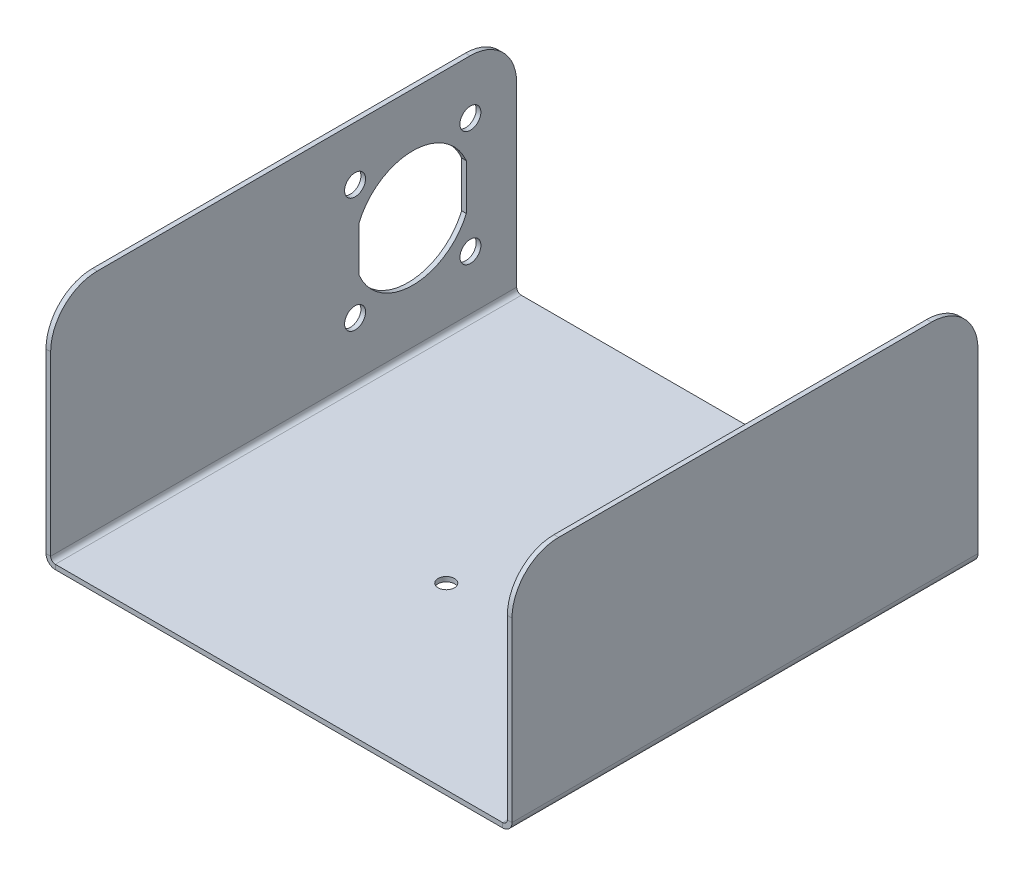
ISO-10303-21;
HEADER;
FILE_DESCRIPTION(('STEP AP214'),'2;1');
FILE_NAME('part.step','',(''),(''),'','','');
FILE_SCHEMA(('AUTOMOTIVE_DESIGN { 1 0 10303 214 1 1 1 1 }'));
ENDSEC;
DATA;
#1=APPLICATION_CONTEXT('core data for automotive mechanical design processes');
#2=APPLICATION_PROTOCOL_DEFINITION('international standard','automotive_design',2000,#1);
#3=PRODUCT_CONTEXT('',#1,'mechanical');
#4=PRODUCT('Part','Part','',(#3));
#5=PRODUCT_RELATED_PRODUCT_CATEGORY('part','',(#4));
#6=PRODUCT_DEFINITION_FORMATION('','',#4);
#7=PRODUCT_DEFINITION_CONTEXT('part definition',#1,'design');
#8=PRODUCT_DEFINITION('design','',#6,#7);
#9=PRODUCT_DEFINITION_SHAPE('','',#8);
#10=(LENGTH_UNIT() NAMED_UNIT(*) SI_UNIT(.MILLI.,.METRE.));
#11=(NAMED_UNIT(*) PLANE_ANGLE_UNIT() SI_UNIT($,.RADIAN.));
#12=(NAMED_UNIT(*) SI_UNIT($,.STERADIAN.) SOLID_ANGLE_UNIT());
#13=UNCERTAINTY_MEASURE_WITH_UNIT(LENGTH_MEASURE(1.E-05),#10,'distance_accuracy_value','');
#14=(GEOMETRIC_REPRESENTATION_CONTEXT(3) GLOBAL_UNCERTAINTY_ASSIGNED_CONTEXT((#13)) GLOBAL_UNIT_ASSIGNED_CONTEXT((#10,
#11,#12)) REPRESENTATION_CONTEXT('',''));
#15=CARTESIAN_POINT('',(0.,0.,0.));
#16=DIRECTION('',(0.,0.,1.));
#17=DIRECTION('',(1.,0.,0.));
#18=AXIS2_PLACEMENT_3D('',#15,#16,#17);
#19=CARTESIAN_POINT('',(0.,-1.,0.));
#20=DIRECTION('',(0.,-1.,0.));
#21=DIRECTION('',(0.,0.,-1.));
#22=AXIS2_PLACEMENT_3D('',#19,#20,#21);
#23=PLANE('',#22);
#24=CARTESIAN_POINT('',(60.,-1.,-60.2));
#25=DIRECTION('',(0.,-1.,0.));
#26=DIRECTION('',(0.,0.,-1.));
#27=AXIS2_PLACEMENT_3D('',#24,#25,#26);
#28=CIRCLE('',#27,1.75);
#29=CARTESIAN_POINT('',(60.,-1.,-61.95));
#30=VERTEX_POINT('',#29);
#31=EDGE_CURVE('E821',#30,#30,#28,.T.);
#32=ORIENTED_EDGE('',*,*,#31,.F.);
#33=EDGE_LOOP('',(#32));
#34=FACE_BOUND('',#33,.T.);
#35=CARTESIAN_POINT('',(72.5573683548742,-1.,-38.4499999999999));
#36=DIRECTION('',(0.,-1.,0.));
#37=DIRECTION('',(0.,0.,-1.));
#38=AXIS2_PLACEMENT_3D('',#35,#36,#37);
#39=CIRCLE('',#38,1.75);
#40=CARTESIAN_POINT('',(72.5573683548742,-1.,-40.1999999999999));
#41=VERTEX_POINT('',#40);
#42=EDGE_CURVE('E816',#41,#41,#39,.T.);
#43=ORIENTED_EDGE('',*,*,#42,.F.);
#44=EDGE_LOOP('',(#43));
#45=FACE_BOUND('',#44,.T.);
#46=CARTESIAN_POINT('',(47.4426316451255,-1.,-38.4500000000001));
#47=DIRECTION('',(0.,-1.,0.));
#48=DIRECTION('',(0.,0.,-1.));
#49=AXIS2_PLACEMENT_3D('',#46,#47,#48);
#50=CIRCLE('',#49,1.75);
#51=CARTESIAN_POINT('',(47.4426316451255,-1.,-40.2000000000001));
#52=VERTEX_POINT('',#51);
#53=EDGE_CURVE('E809',#52,#52,#50,.T.);
#54=ORIENTED_EDGE('',*,*,#53,.F.);
#55=EDGE_LOOP('',(#54));
#56=FACE_BOUND('',#55,.T.);
#57=CARTESIAN_POINT('',(59.9999999999999,-1.,-45.7));
#58=DIRECTION('',(0.,-1.,0.));
#59=DIRECTION('',(0.,0.,-1.));
#60=AXIS2_PLACEMENT_3D('',#57,#58,#59);
#61=CIRCLE('',#60,3.24999999999999);
#62=CARTESIAN_POINT('',(59.9999999999999,-1.,-48.95));
#63=VERTEX_POINT('',#62);
#64=EDGE_CURVE('E254',#63,#63,#61,.T.);
#65=ORIENTED_EDGE('',*,*,#64,.F.);
#66=EDGE_LOOP('',(#65));
#67=FACE_BOUND('',#66,.T.);
#68=DIRECTION('',(1.,0.,0.));
#69=VECTOR('',#68,1.);
#70=CARTESIAN_POINT('',(0.,-1.,0.));
#71=LINE('',#70,#69);
#72=CARTESIAN_POINT('',(2.00000000000001,-1.00000000000001,0.));
#73=VERTEX_POINT('',#72);
#74=CARTESIAN_POINT('',(97.9999999999999,-1.,0.));
#75=VERTEX_POINT('',#74);
#76=EDGE_CURVE('E467',#73,#75,#71,.T.);
#77=ORIENTED_EDGE('',*,*,#76,.F.);
#78=DIRECTION('',(0.,0.,1.));
#79=VECTOR('',#78,1.);
#80=CARTESIAN_POINT('',(2.00000000000001,-1.00000000000001,0.));
#81=LINE('',#80,#79);
#82=CARTESIAN_POINT('',(2.,-1.,-100.));
#83=VERTEX_POINT('',#82);
#84=EDGE_CURVE('E393',#73,#83,#81,.F.);
#85=ORIENTED_EDGE('',*,*,#84,.T.);
#86=DIRECTION('',(-1.,0.,0.));
#87=VECTOR('',#86,1.);
#88=CARTESIAN_POINT('',(0.,-1.,-100.));
#89=LINE('',#88,#87);
#90=CARTESIAN_POINT('',(98.,-1.00000000000001,-100.));
#91=VERTEX_POINT('',#90);
#92=EDGE_CURVE('E469',#91,#83,#89,.T.);
#93=ORIENTED_EDGE('',*,*,#92,.F.);
#94=DIRECTION('',(0.,0.,-1.));
#95=VECTOR('',#94,1.);
#96=CARTESIAN_POINT('',(98.,-1.00000000000001,-100.));
#97=LINE('',#96,#95);
#98=EDGE_CURVE('E443',#91,#75,#97,.F.);
#99=ORIENTED_EDGE('',*,*,#98,.T.);
#100=EDGE_LOOP('',(#77,#85,#93,#99));
#101=FACE_BOUND('',#100,.T.);
#102=ADVANCED_FACE('F74',(#34,#45,#56,#67,#101),#23,.T.);
#103=CARTESIAN_POINT('',(0.,0.,0.));
#104=DIRECTION('',(0.,-1.,0.));
#105=DIRECTION('',(0.,0.,-1.));
#106=AXIS2_PLACEMENT_3D('',#103,#104,#105);
#107=PLANE('',#106);
#108=CARTESIAN_POINT('',(60.,0.,-60.2));
#109=DIRECTION('',(0.,-1.,0.));
#110=DIRECTION('',(0.,0.,-1.));
#111=AXIS2_PLACEMENT_3D('',#108,#109,#110);
#112=CIRCLE('',#111,1.75);
#113=CARTESIAN_POINT('',(60.,0.,-61.95));
#114=VERTEX_POINT('',#113);
#115=EDGE_CURVE('E78',#114,#114,#112,.T.);
#116=ORIENTED_EDGE('',*,*,#115,.T.);
#117=EDGE_LOOP('',(#116));
#118=FACE_BOUND('',#117,.T.);
#119=CARTESIAN_POINT('',(72.5573683548742,0.,-38.4499999999999));
#120=DIRECTION('',(0.,-1.,0.));
#121=DIRECTION('',(0.,0.,-1.));
#122=AXIS2_PLACEMENT_3D('',#119,#120,#121);
#123=CIRCLE('',#122,1.75);
#124=CARTESIAN_POINT('',(72.5573683548742,0.,-40.1999999999999));
#125=VERTEX_POINT('',#124);
#126=EDGE_CURVE('E256',#125,#125,#123,.T.);
#127=ORIENTED_EDGE('',*,*,#126,.T.);
#128=EDGE_LOOP('',(#127));
#129=FACE_BOUND('',#128,.T.);
#130=CARTESIAN_POINT('',(47.4426316451255,0.,-38.4500000000001));
#131=DIRECTION('',(0.,-1.,0.));
#132=DIRECTION('',(0.,0.,-1.));
#133=AXIS2_PLACEMENT_3D('',#130,#131,#132);
#134=CIRCLE('',#133,1.75);
#135=CARTESIAN_POINT('',(47.4426316451255,0.,-40.2000000000001));
#136=VERTEX_POINT('',#135);
#137=EDGE_CURVE('E253',#136,#136,#134,.T.);
#138=ORIENTED_EDGE('',*,*,#137,.T.);
#139=EDGE_LOOP('',(#138));
#140=FACE_BOUND('',#139,.T.);
#141=CARTESIAN_POINT('',(59.9999999999999,0.,-45.7));
#142=DIRECTION('',(0.,-1.,0.));
#143=DIRECTION('',(0.,0.,-1.));
#144=AXIS2_PLACEMENT_3D('',#141,#142,#143);
#145=CIRCLE('',#144,3.24999999999999);
#146=CARTESIAN_POINT('',(59.9999999999999,0.,-48.95));
#147=VERTEX_POINT('',#146);
#148=EDGE_CURVE('E250',#147,#147,#145,.T.);
#149=ORIENTED_EDGE('',*,*,#148,.T.);
#150=EDGE_LOOP('',(#149));
#151=FACE_BOUND('',#150,.T.);
#152=DIRECTION('',(0.,0.,1.));
#153=VECTOR('',#152,1.);
#154=CARTESIAN_POINT('',(2.,0.,0.));
#155=LINE('',#154,#153);
#156=CARTESIAN_POINT('',(2.,0.,0.));
#157=VERTEX_POINT('',#156);
#158=CARTESIAN_POINT('',(2.,0.,-100.));
#159=VERTEX_POINT('',#158);
#160=EDGE_CURVE('E406',#157,#159,#155,.F.);
#161=ORIENTED_EDGE('',*,*,#160,.F.);
#162=DIRECTION('',(1.,0.,0.));
#163=VECTOR('',#162,1.);
#164=CARTESIAN_POINT('',(0.,0.,0.));
#165=LINE('',#164,#163);
#166=CARTESIAN_POINT('',(98.,0.,0.));
#167=VERTEX_POINT('',#166);
#168=EDGE_CURVE('E464',#157,#167,#165,.T.);
#169=ORIENTED_EDGE('',*,*,#168,.T.);
#170=DIRECTION('',(0.,0.,-1.));
#171=VECTOR('',#170,1.);
#172=CARTESIAN_POINT('',(98.,0.,-100.));
#173=LINE('',#172,#171);
#174=CARTESIAN_POINT('',(98.,0.,-100.));
#175=VERTEX_POINT('',#174);
#176=EDGE_CURVE('E456',#175,#167,#173,.F.);
#177=ORIENTED_EDGE('',*,*,#176,.F.);
#178=DIRECTION('',(-1.,0.,0.));
#179=VECTOR('',#178,1.);
#180=CARTESIAN_POINT('',(0.,0.,-100.));
#181=LINE('',#180,#179);
#182=EDGE_CURVE('E470',#175,#159,#181,.T.);
#183=ORIENTED_EDGE('',*,*,#182,.T.);
#184=EDGE_LOOP('',(#161,#169,#177,#183));
#185=FACE_BOUND('',#184,.T.);
#186=ADVANCED_FACE('F263',(#118,#129,#140,#151,#185),#107,.F.);
#187=CARTESIAN_POINT('',(0.,-1.,0.));
#188=DIRECTION('',(0.,0.,1.));
#189=DIRECTION('',(1.,0.,0.));
#190=AXIS2_PLACEMENT_3D('',#187,#188,#189);
#191=PLANE('',#190);
#192=ORIENTED_EDGE('',*,*,#168,.F.);
#193=DIRECTION('',(0.,-1.,0.));
#194=VECTOR('',#193,1.);
#195=CARTESIAN_POINT('',(2.,0.,0.));
#196=LINE('',#195,#194);
#197=EDGE_CURVE('E400',#157,#73,#196,.T.);
#198=ORIENTED_EDGE('',*,*,#197,.T.);
#199=ORIENTED_EDGE('',*,*,#76,.T.);
#200=DIRECTION('',(0.,-1.,0.));
#201=VECTOR('',#200,1.);
#202=CARTESIAN_POINT('',(98.,0.,0.));
#203=LINE('',#202,#201);
#204=EDGE_CURVE('E461',#167,#75,#203,.T.);
#205=ORIENTED_EDGE('',*,*,#204,.F.);
#206=EDGE_LOOP('',(#192,#198,#199,#205));
#207=FACE_BOUND('',#206,.T.);
#208=ADVANCED_FACE('F284',(#207),#191,.T.);
#209=CARTESIAN_POINT('',(0.,-1.,-100.));
#210=DIRECTION('',(0.,0.,-1.));
#211=DIRECTION('',(-1.,0.,0.));
#212=AXIS2_PLACEMENT_3D('',#209,#210,#211);
#213=PLANE('',#212);
#214=DIRECTION('',(0.,-1.,0.));
#215=VECTOR('',#214,1.);
#216=CARTESIAN_POINT('',(2.,0.,-100.));
#217=LINE('',#216,#215);
#218=EDGE_CURVE('E411',#159,#83,#217,.T.);
#219=ORIENTED_EDGE('',*,*,#218,.F.);
#220=ORIENTED_EDGE('',*,*,#182,.F.);
#221=DIRECTION('',(0.,-1.,0.));
#222=VECTOR('',#221,1.);
#223=CARTESIAN_POINT('',(98.,0.,-100.));
#224=LINE('',#223,#222);
#225=EDGE_CURVE('E450',#175,#91,#224,.T.);
#226=ORIENTED_EDGE('',*,*,#225,.T.);
#227=ORIENTED_EDGE('',*,*,#92,.T.);
#228=EDGE_LOOP('',(#219,#220,#226,#227));
#229=FACE_BOUND('',#228,.T.);
#230=ADVANCED_FACE('F292',(#229),#213,.T.);
#231=CARTESIAN_POINT('',(98.,1.,0.));
#232=DIRECTION('',(0.,0.,1.));
#233=DIRECTION('',(1.,0.,0.));
#234=AXIS2_PLACEMENT_3D('',#231,#232,#233);
#235=PLANE('',#234);
#236=DIRECTION('',(-1.,0.,0.));
#237=VECTOR('',#236,1.);
#238=CARTESIAN_POINT('',(100.,0.999999999999997,0.));
#239=LINE('',#238,#237);
#240=CARTESIAN_POINT('',(99.,1.,0.));
#241=VERTEX_POINT('',#240);
#242=CARTESIAN_POINT('',(100.,0.999999999999997,0.));
#243=VERTEX_POINT('',#242);
#244=EDGE_CURVE('E414',#241,#243,#239,.F.);
#245=ORIENTED_EDGE('',*,*,#244,.F.);
#246=CARTESIAN_POINT('',(98.,1.,0.));
#247=DIRECTION('',(0.,0.,-1.));
#248=DIRECTION('',(-1.,0.,0.));
#249=AXIS2_PLACEMENT_3D('',#246,#247,#248);
#250=CIRCLE('',#249,1.00000000000001);
#251=EDGE_CURVE('E453',#167,#241,#250,.F.);
#252=ORIENTED_EDGE('',*,*,#251,.F.);
#253=ORIENTED_EDGE('',*,*,#204,.T.);
#254=CARTESIAN_POINT('',(98.,1.,0.));
#255=DIRECTION('',(0.,0.,-1.));
#256=DIRECTION('',(-1.,0.,0.));
#257=AXIS2_PLACEMENT_3D('',#254,#255,#256);
#258=CIRCLE('',#257,2.00000000000001);
#259=EDGE_CURVE('E446',#75,#243,#258,.F.);
#260=ORIENTED_EDGE('',*,*,#259,.T.);
#261=EDGE_LOOP('',(#245,#252,#253,#260));
#262=FACE_BOUND('',#261,.T.);
#263=ADVANCED_FACE('F295',(#262),#235,.T.);
#264=CARTESIAN_POINT('',(98.,1.,-100.));
#265=DIRECTION('',(0.,0.,1.));
#266=DIRECTION('',(1.,0.,0.));
#267=AXIS2_PLACEMENT_3D('',#264,#265,#266);
#268=PLANE('',#267);
#269=CARTESIAN_POINT('',(98.,1.,-100.));
#270=DIRECTION('',(0.,0.,-1.));
#271=DIRECTION('',(-1.,0.,0.));
#272=AXIS2_PLACEMENT_3D('',#269,#270,#271);
#273=CIRCLE('',#272,1.00000000000001);
#274=CARTESIAN_POINT('',(99.,1.,-100.));
#275=VERTEX_POINT('',#274);
#276=EDGE_CURVE('E419',#275,#175,#273,.T.);
#277=ORIENTED_EDGE('',*,*,#276,.F.);
#278=DIRECTION('',(-1.,0.,0.));
#279=VECTOR('',#278,1.);
#280=CARTESIAN_POINT('',(99.,1.,-100.));
#281=LINE('',#280,#279);
#282=CARTESIAN_POINT('',(100.,0.999999999999997,-100.));
#283=VERTEX_POINT('',#282);
#284=EDGE_CURVE('E436',#275,#283,#281,.F.);
#285=ORIENTED_EDGE('',*,*,#284,.T.);
#286=CARTESIAN_POINT('',(98.,1.,-100.));
#287=DIRECTION('',(0.,0.,-1.));
#288=DIRECTION('',(-1.,0.,0.));
#289=AXIS2_PLACEMENT_3D('',#286,#287,#288);
#290=CIRCLE('',#289,2.00000000000001);
#291=EDGE_CURVE('E447',#283,#91,#290,.T.);
#292=ORIENTED_EDGE('',*,*,#291,.T.);
#293=ORIENTED_EDGE('',*,*,#225,.F.);
#294=EDGE_LOOP('',(#277,#285,#292,#293));
#295=FACE_BOUND('',#294,.T.);
#296=ADVANCED_FACE('F289',(#295),#268,.F.);
#297=CARTESIAN_POINT('',(98.,1.,-100.));
#298=DIRECTION('',(0.,0.,-1.));
#299=DIRECTION('',(1.,0.,0.));
#300=AXIS2_PLACEMENT_3D('',#297,#298,#299);
#301=CYLINDRICAL_SURFACE('',#300,2.00000000000001);
#302=ORIENTED_EDGE('',*,*,#98,.F.);
#303=ORIENTED_EDGE('',*,*,#291,.F.);
#304=DIRECTION('',(0.,0.,-1.));
#305=VECTOR('',#304,1.);
#306=CARTESIAN_POINT('',(100.,0.999999999999997,0.));
#307=LINE('',#306,#305);
#308=EDGE_CURVE('E433',#283,#243,#307,.F.);
#309=ORIENTED_EDGE('',*,*,#308,.T.);
#310=ORIENTED_EDGE('',*,*,#259,.F.);
#311=EDGE_LOOP('',(#302,#303,#309,#310));
#312=FACE_BOUND('',#311,.T.);
#313=ADVANCED_FACE('F515',(#312),#301,.T.);
#314=CARTESIAN_POINT('',(98.,1.,-100.));
#315=DIRECTION('',(0.,0.,-1.));
#316=DIRECTION('',(1.,0.,0.));
#317=AXIS2_PLACEMENT_3D('',#314,#315,#316);
#318=CYLINDRICAL_SURFACE('',#317,1.00000000000001);
#319=ORIENTED_EDGE('',*,*,#176,.T.);
#320=ORIENTED_EDGE('',*,*,#251,.T.);
#321=DIRECTION('',(0.,0.,-1.));
#322=VECTOR('',#321,1.);
#323=CARTESIAN_POINT('',(99.,1.,0.));
#324=LINE('',#323,#322);
#325=EDGE_CURVE('E439',#241,#275,#324,.T.);
#326=ORIENTED_EDGE('',*,*,#325,.T.);
#327=ORIENTED_EDGE('',*,*,#276,.T.);
#328=EDGE_LOOP('',(#319,#320,#326,#327));
#329=FACE_BOUND('',#328,.T.);
#330=ADVANCED_FACE('F514',(#329),#318,.F.);
#331=CARTESIAN_POINT('',(100.,49.,-100.));
#332=DIRECTION('',(0.,0.,1.));
#333=DIRECTION('',(0.,-1.,0.));
#334=AXIS2_PLACEMENT_3D('',#331,#332,#333);
#335=PLANE('',#334);
#336=DIRECTION('',(0.,-1.,0.));
#337=VECTOR('',#336,1.);
#338=CARTESIAN_POINT('',(99.0000000000001,49.,-100.));
#339=LINE('',#338,#337);
#340=CARTESIAN_POINT('',(99.0000000000001,39.,-100.));
#341=VERTEX_POINT('',#340);
#342=EDGE_CURVE('E430',#275,#341,#339,.F.);
#343=ORIENTED_EDGE('',*,*,#342,.T.);
#344=DIRECTION('',(-1.,0.,0.));
#345=VECTOR('',#344,1.);
#346=CARTESIAN_POINT('',(100.,39.,-100.));
#347=LINE('',#346,#345);
#348=CARTESIAN_POINT('',(100.,39.,-100.));
#349=VERTEX_POINT('',#348);
#350=EDGE_CURVE('E326',#341,#349,#347,.F.);
#351=ORIENTED_EDGE('',*,*,#350,.T.);
#352=DIRECTION('',(0.,1.,0.));
#353=VECTOR('',#352,1.);
#354=CARTESIAN_POINT('',(100.,-3.1503365661631E-13,-100.));
#355=LINE('',#354,#353);
#356=EDGE_CURVE('E422',#283,#349,#355,.T.);
#357=ORIENTED_EDGE('',*,*,#356,.F.);
#358=ORIENTED_EDGE('',*,*,#284,.F.);
#359=EDGE_LOOP('',(#343,#351,#357,#358));
#360=FACE_BOUND('',#359,.T.);
#361=ADVANCED_FACE('F490',(#360),#335,.F.);
#362=CARTESIAN_POINT('',(100.,0.,0.));
#363=DIRECTION('',(0.,0.,-1.));
#364=DIRECTION('',(0.,1.,0.));
#365=AXIS2_PLACEMENT_3D('',#362,#363,#364);
#366=PLANE('',#365);
#367=DIRECTION('',(0.,-1.,0.));
#368=VECTOR('',#367,1.);
#369=CARTESIAN_POINT('',(100.,-3.43355672550626E-13,0.));
#370=LINE('',#369,#368);
#371=CARTESIAN_POINT('',(100.,39.,0.));
#372=VERTEX_POINT('',#371);
#373=EDGE_CURVE('E417',#372,#243,#370,.T.);
#374=ORIENTED_EDGE('',*,*,#373,.F.);
#375=DIRECTION('',(-1.,0.,0.));
#376=VECTOR('',#375,1.);
#377=CARTESIAN_POINT('',(100.,39.,0.));
#378=LINE('',#377,#376);
#379=CARTESIAN_POINT('',(99.0000000000001,39.,0.));
#380=VERTEX_POINT('',#379);
#381=EDGE_CURVE('E321',#372,#380,#378,.T.);
#382=ORIENTED_EDGE('',*,*,#381,.T.);
#383=DIRECTION('',(0.,1.,0.));
#384=VECTOR('',#383,1.);
#385=CARTESIAN_POINT('',(99.,0.,0.));
#386=LINE('',#385,#384);
#387=EDGE_CURVE('E425',#380,#241,#386,.F.);
#388=ORIENTED_EDGE('',*,*,#387,.T.);
#389=ORIENTED_EDGE('',*,*,#244,.T.);
#390=EDGE_LOOP('',(#374,#382,#388,#389));
#391=FACE_BOUND('',#390,.T.);
#392=ADVANCED_FACE('F511',(#391),#366,.F.);
#393=CARTESIAN_POINT('',(100.,-3.43355672550626E-13,0.));
#394=DIRECTION('',(-1.,0.,0.));
#395=DIRECTION('',(0.,-1.,0.));
#396=AXIS2_PLACEMENT_3D('',#393,#394,#395);
#397=PLANE('',#396);
#398=ORIENTED_EDGE('',*,*,#356,.T.);
#399=CARTESIAN_POINT('',(100.,39.,-90.));
#400=DIRECTION('',(-1.,0.,0.));
#401=DIRECTION('',(0.,-1.,0.));
#402=AXIS2_PLACEMENT_3D('',#399,#400,#401);
#403=CIRCLE('',#402,10.);
#404=CARTESIAN_POINT('',(100.,49.,-90.));
#405=VERTEX_POINT('',#404);
#406=EDGE_CURVE('E325',#349,#405,#403,.F.);
#407=ORIENTED_EDGE('',*,*,#406,.T.);
#408=DIRECTION('',(0.,0.,1.));
#409=VECTOR('',#408,1.);
#410=CARTESIAN_POINT('',(100.,49.,0.));
#411=LINE('',#410,#409);
#412=CARTESIAN_POINT('',(100.,49.,-10.));
#413=VERTEX_POINT('',#412);
#414=EDGE_CURVE('E420',#405,#413,#411,.T.);
#415=ORIENTED_EDGE('',*,*,#414,.T.);
#416=CARTESIAN_POINT('',(100.,39.,-10.));
#417=DIRECTION('',(-1.,0.,0.));
#418=DIRECTION('',(0.,-1.,0.));
#419=AXIS2_PLACEMENT_3D('',#416,#417,#418);
#420=CIRCLE('',#419,10.);
#421=EDGE_CURVE('E318',#413,#372,#420,.F.);
#422=ORIENTED_EDGE('',*,*,#421,.T.);
#423=ORIENTED_EDGE('',*,*,#373,.T.);
#424=ORIENTED_EDGE('',*,*,#308,.F.);
#425=EDGE_LOOP('',(#398,#407,#415,#422,#423,#424));
#426=FACE_BOUND('',#425,.T.);
#427=ADVANCED_FACE('F494',(#426),#397,.F.);
#428=CARTESIAN_POINT('',(99.,-3.39864191211782E-13,0.));
#429=DIRECTION('',(-1.,0.,0.));
#430=DIRECTION('',(0.,-1.,0.));
#431=AXIS2_PLACEMENT_3D('',#428,#429,#430);
#432=PLANE('',#431);
#433=DIRECTION('',(0.,0.,-1.));
#434=VECTOR('',#433,1.);
#435=CARTESIAN_POINT('',(99.0000000000002,49.,0.));
#436=LINE('',#435,#434);
#437=CARTESIAN_POINT('',(99.0000000000001,49.,-90.));
#438=VERTEX_POINT('',#437);
#439=CARTESIAN_POINT('',(99.0000000000002,49.,-10.));
#440=VERTEX_POINT('',#439);
#441=EDGE_CURVE('E427',#438,#440,#436,.F.);
#442=ORIENTED_EDGE('',*,*,#441,.F.);
#443=CARTESIAN_POINT('',(99.0000000000001,39.,-90.));
#444=DIRECTION('',(-1.,0.,0.));
#445=DIRECTION('',(0.,-1.,0.));
#446=AXIS2_PLACEMENT_3D('',#443,#444,#445);
#447=CIRCLE('',#446,10.);
#448=EDGE_CURVE('E330',#438,#341,#447,.T.);
#449=ORIENTED_EDGE('',*,*,#448,.T.);
#450=ORIENTED_EDGE('',*,*,#342,.F.);
#451=ORIENTED_EDGE('',*,*,#325,.F.);
#452=ORIENTED_EDGE('',*,*,#387,.F.);
#453=CARTESIAN_POINT('',(99.0000000000001,39.,-10.));
#454=DIRECTION('',(-1.,0.,0.));
#455=DIRECTION('',(0.,-1.,0.));
#456=AXIS2_PLACEMENT_3D('',#453,#454,#455);
#457=CIRCLE('',#456,10.);
#458=EDGE_CURVE('E480',#380,#440,#457,.T.);
#459=ORIENTED_EDGE('',*,*,#458,.T.);
#460=EDGE_LOOP('',(#442,#449,#450,#451,#452,#459));
#461=FACE_BOUND('',#460,.T.);
#462=ADVANCED_FACE('F484',(#461),#432,.T.);
#463=CARTESIAN_POINT('',(100.,49.,0.));
#464=DIRECTION('',(0.,-1.,0.));
#465=DIRECTION('',(1.,0.,0.));
#466=AXIS2_PLACEMENT_3D('',#463,#464,#465);
#467=PLANE('',#466);
#468=ORIENTED_EDGE('',*,*,#414,.F.);
#469=DIRECTION('',(-1.,0.,0.));
#470=VECTOR('',#469,1.);
#471=CARTESIAN_POINT('',(100.,49.,-90.));
#472=LINE('',#471,#470);
#473=EDGE_CURVE('E477',#405,#438,#472,.T.);
#474=ORIENTED_EDGE('',*,*,#473,.T.);
#475=ORIENTED_EDGE('',*,*,#441,.T.);
#476=DIRECTION('',(-1.,0.,0.));
#477=VECTOR('',#476,1.);
#478=CARTESIAN_POINT('',(100.,49.,-10.));
#479=LINE('',#478,#477);
#480=EDGE_CURVE('E319',#440,#413,#479,.F.);
#481=ORIENTED_EDGE('',*,*,#480,.T.);
#482=EDGE_LOOP('',(#468,#474,#475,#481));
#483=FACE_BOUND('',#482,.T.);
#484=ADVANCED_FACE('F497',(#483),#467,.F.);
#485=CARTESIAN_POINT('',(1.99999999999999,0.999999999999998,-100.));
#486=DIRECTION('',(0.,0.,-1.));
#487=DIRECTION('',(-1.,0.,0.));
#488=AXIS2_PLACEMENT_3D('',#485,#486,#487);
#489=PLANE('',#488);
#490=DIRECTION('',(1.,0.,0.));
#491=VECTOR('',#490,1.);
#492=CARTESIAN_POINT('',(0.,0.999999999999993,-100.));
#493=LINE('',#492,#491);
#494=CARTESIAN_POINT('',(0.999999999999976,0.999999999999995,-100.));
#495=VERTEX_POINT('',#494);
#496=CARTESIAN_POINT('',(0.,0.999999999999991,-100.));
#497=VERTEX_POINT('',#496);
#498=EDGE_CURVE('E390',#495,#497,#493,.F.);
#499=ORIENTED_EDGE('',*,*,#498,.F.);
#500=CARTESIAN_POINT('',(1.99999999999999,0.999999999999998,-100.));
#501=DIRECTION('',(0.,0.,1.));
#502=DIRECTION('',(1.,0.,0.));
#503=AXIS2_PLACEMENT_3D('',#500,#501,#502);
#504=CIRCLE('',#503,1.00000000000001);
#505=EDGE_CURVE('E403',#159,#495,#504,.F.);
#506=ORIENTED_EDGE('',*,*,#505,.F.);
#507=ORIENTED_EDGE('',*,*,#218,.T.);
#508=CARTESIAN_POINT('',(1.99999999999999,0.999999999999998,-100.));
#509=DIRECTION('',(0.,0.,1.));
#510=DIRECTION('',(1.,0.,0.));
#511=AXIS2_PLACEMENT_3D('',#508,#509,#510);
#512=CIRCLE('',#511,2.00000000000001);
#513=EDGE_CURVE('E396',#83,#497,#512,.F.);
#514=ORIENTED_EDGE('',*,*,#513,.T.);
#515=EDGE_LOOP('',(#499,#506,#507,#514));
#516=FACE_BOUND('',#515,.T.);
#517=ADVANCED_FACE('F499',(#516),#489,.T.);
#518=CARTESIAN_POINT('',(1.99999999999999,0.999999999999998,0.));
#519=DIRECTION('',(0.,0.,-1.));
#520=DIRECTION('',(-1.,0.,0.));
#521=AXIS2_PLACEMENT_3D('',#518,#519,#520);
#522=PLANE('',#521);
#523=CARTESIAN_POINT('',(1.99999999999999,0.999999999999998,0.));
#524=DIRECTION('',(0.,0.,1.));
#525=DIRECTION('',(1.,0.,0.));
#526=AXIS2_PLACEMENT_3D('',#523,#524,#525);
#527=CIRCLE('',#526,1.00000000000001);
#528=CARTESIAN_POINT('',(0.999999999999976,0.999999999999995,0.));
#529=VERTEX_POINT('',#528);
#530=EDGE_CURVE('E408',#529,#157,#527,.T.);
#531=ORIENTED_EDGE('',*,*,#530,.F.);
#532=DIRECTION('',(1.,0.,0.));
#533=VECTOR('',#532,1.);
#534=CARTESIAN_POINT('',(0.999999999999997,0.999999999999993,0.));
#535=LINE('',#534,#533);
#536=CARTESIAN_POINT('',(0.,0.999999999999989,0.));
#537=VERTEX_POINT('',#536);
#538=EDGE_CURVE('E385',#529,#537,#535,.F.);
#539=ORIENTED_EDGE('',*,*,#538,.T.);
#540=CARTESIAN_POINT('',(1.99999999999999,0.999999999999998,0.));
#541=DIRECTION('',(0.,0.,1.));
#542=DIRECTION('',(1.,0.,0.));
#543=AXIS2_PLACEMENT_3D('',#540,#541,#542);
#544=CIRCLE('',#543,2.00000000000001);
#545=EDGE_CURVE('E397',#537,#73,#544,.T.);
#546=ORIENTED_EDGE('',*,*,#545,.T.);
#547=ORIENTED_EDGE('',*,*,#197,.F.);
#548=EDGE_LOOP('',(#531,#539,#546,#547));
#549=FACE_BOUND('',#548,.T.);
#550=ADVANCED_FACE('F505',(#549),#522,.F.);
#551=CARTESIAN_POINT('',(1.99999999999999,0.999999999999998,0.));
#552=DIRECTION('',(0.,0.,1.));
#553=DIRECTION('',(-1.,0.,0.));
#554=AXIS2_PLACEMENT_3D('',#551,#552,#553);
#555=CYLINDRICAL_SURFACE('',#554,2.00000000000001);
#556=ORIENTED_EDGE('',*,*,#84,.F.);
#557=ORIENTED_EDGE('',*,*,#545,.F.);
#558=DIRECTION('',(0.,0.,1.));
#559=VECTOR('',#558,1.);
#560=CARTESIAN_POINT('',(0.,0.999999999999993,-100.));
#561=LINE('',#560,#559);
#562=EDGE_CURVE('E367',#537,#497,#561,.F.);
#563=ORIENTED_EDGE('',*,*,#562,.T.);
#564=ORIENTED_EDGE('',*,*,#513,.F.);
#565=EDGE_LOOP('',(#556,#557,#563,#564));
#566=FACE_BOUND('',#565,.T.);
#567=ADVANCED_FACE('F546',(#566),#555,.T.);
#568=CARTESIAN_POINT('',(1.99999999999999,0.999999999999998,0.));
#569=DIRECTION('',(0.,0.,1.));
#570=DIRECTION('',(-1.,0.,0.));
#571=AXIS2_PLACEMENT_3D('',#568,#569,#570);
#572=CYLINDRICAL_SURFACE('',#571,1.00000000000001);
#573=ORIENTED_EDGE('',*,*,#160,.T.);
#574=ORIENTED_EDGE('',*,*,#505,.T.);
#575=DIRECTION('',(0.,0.,1.));
#576=VECTOR('',#575,1.);
#577=CARTESIAN_POINT('',(0.999999999999976,0.999999999999997,-100.));
#578=LINE('',#577,#576);
#579=EDGE_CURVE('E388',#495,#529,#578,.T.);
#580=ORIENTED_EDGE('',*,*,#579,.T.);
#581=ORIENTED_EDGE('',*,*,#530,.T.);
#582=EDGE_LOOP('',(#573,#574,#580,#581));
#583=FACE_BOUND('',#582,.T.);
#584=ADVANCED_FACE('F551',(#583),#572,.F.);
#585=CARTESIAN_POINT('',(0.,0.,-100.));
#586=DIRECTION('',(0.,0.,1.));
#587=DIRECTION('',(1.,0.,0.));
#588=AXIS2_PLACEMENT_3D('',#585,#586,#587);
#589=PLANE('',#588);
#590=DIRECTION('',(0.,-1.,0.));
#591=VECTOR('',#590,1.);
#592=CARTESIAN_POINT('',(0.,0.,-100.));
#593=LINE('',#592,#591);
#594=CARTESIAN_POINT('',(-1.56984453926604E-13,39.,-100.));
#595=VERTEX_POINT('',#594);
#596=EDGE_CURVE('E369',#595,#497,#593,.T.);
#597=ORIENTED_EDGE('',*,*,#596,.F.);
#598=DIRECTION('',(1.,0.,0.));
#599=VECTOR('',#598,1.);
#600=CARTESIAN_POINT('',(-1.56984453926604E-13,39.,-100.));
#601=LINE('',#600,#599);
#602=CARTESIAN_POINT('',(0.999999999999843,39.,-100.));
#603=VERTEX_POINT('',#602);
#604=EDGE_CURVE('E328',#595,#603,#601,.T.);
#605=ORIENTED_EDGE('',*,*,#604,.T.);
#606=DIRECTION('',(0.,1.,0.));
#607=VECTOR('',#606,1.);
#608=CARTESIAN_POINT('',(0.999999999999979,0.,-100.));
#609=LINE('',#608,#607);
#610=EDGE_CURVE('E380',#603,#495,#609,.F.);
#611=ORIENTED_EDGE('',*,*,#610,.T.);
#612=ORIENTED_EDGE('',*,*,#498,.T.);
#613=EDGE_LOOP('',(#597,#605,#611,#612));
#614=FACE_BOUND('',#613,.T.);
#615=ADVANCED_FACE('F553',(#614),#589,.F.);
#616=CARTESIAN_POINT('',(-1.71087102818213E-13,49.,0.));
#617=DIRECTION('',(0.,0.,-1.));
#618=DIRECTION('',(-1.,0.,0.));
#619=AXIS2_PLACEMENT_3D('',#616,#617,#618);
#620=PLANE('',#619);
#621=DIRECTION('',(0.,-1.,0.));
#622=VECTOR('',#621,1.);
#623=CARTESIAN_POINT('',(0.999999999999829,49.,0.));
#624=LINE('',#623,#622);
#625=CARTESIAN_POINT('',(0.999999999999864,39.,0.));
#626=VERTEX_POINT('',#625);
#627=EDGE_CURVE('E359',#529,#626,#624,.F.);
#628=ORIENTED_EDGE('',*,*,#627,.T.);
#629=DIRECTION('',(1.,0.,0.));
#630=VECTOR('',#629,1.);
#631=CARTESIAN_POINT('',(-1.36172289429781E-13,39.,0.));
#632=LINE('',#631,#630);
#633=CARTESIAN_POINT('',(-1.36167772214882E-13,39.,0.));
#634=VERTEX_POINT('',#633);
#635=EDGE_CURVE('E215',#626,#634,#632,.F.);
#636=ORIENTED_EDGE('',*,*,#635,.T.);
#637=DIRECTION('',(0.,1.,0.));
#638=VECTOR('',#637,1.);
#639=CARTESIAN_POINT('',(0.,0.,0.));
#640=LINE('',#639,#638);
#641=EDGE_CURVE('E357',#537,#634,#640,.T.);
#642=ORIENTED_EDGE('',*,*,#641,.F.);
#643=ORIENTED_EDGE('',*,*,#538,.F.);
#644=EDGE_LOOP('',(#628,#636,#642,#643));
#645=FACE_BOUND('',#644,.T.);
#646=ADVANCED_FACE('F355',(#645),#620,.F.);
#647=CARTESIAN_POINT('',(0.,0.,0.));
#648=DIRECTION('',(1.,0.,0.));
#649=DIRECTION('',(0.,1.,0.));
#650=AXIS2_PLACEMENT_3D('',#647,#648,#649);
#651=PLANE('',#650);
#652=CARTESIAN_POINT('',(0.,12.6256313292355,-90.0743686707643));
#653=DIRECTION('',(1.,0.,0.));
#654=DIRECTION('',(0.,1.,0.));
#655=AXIS2_PLACEMENT_3D('',#652,#653,#654);
#656=CIRCLE('',#655,2.25000000000001);
#657=CARTESIAN_POINT('',(0.,14.8756313292355,-90.0743686707643));
#658=VERTEX_POINT('',#657);
#659=EDGE_CURVE('E249',#658,#658,#656,.T.);
#660=ORIENTED_EDGE('',*,*,#659,.T.);
#661=EDGE_LOOP('',(#660));
#662=FACE_BOUND('',#661,.T.);
#663=CARTESIAN_POINT('',(0.,12.6256313292358,-65.3256313292351));
#664=DIRECTION('',(1.,0.,0.));
#665=DIRECTION('',(0.,1.,0.));
#666=AXIS2_PLACEMENT_3D('',#663,#664,#665);
#667=CIRCLE('',#666,2.25000000000001);
#668=CARTESIAN_POINT('',(0.,14.8756313292358,-65.3256313292351));
#669=VERTEX_POINT('',#668);
#670=EDGE_CURVE('E245',#669,#669,#667,.T.);
#671=ORIENTED_EDGE('',*,*,#670,.T.);
#672=EDGE_LOOP('',(#671));
#673=FACE_BOUND('',#672,.T.);
#674=CARTESIAN_POINT('',(-1.43982048506075E-13,37.374368670765,-65.3256313292354));
#675=DIRECTION('',(1.,0.,0.));
#676=DIRECTION('',(0.,1.,0.));
#677=AXIS2_PLACEMENT_3D('',#674,#675,#676);
#678=CIRCLE('',#677,2.25000000000001);
#679=CARTESIAN_POINT('',(-1.51837881518472E-13,39.624368670765,-65.3256313292354));
#680=VERTEX_POINT('',#679);
#681=EDGE_CURVE('E241',#680,#680,#678,.T.);
#682=ORIENTED_EDGE('',*,*,#681,.T.);
#683=EDGE_LOOP('',(#682));
#684=FACE_BOUND('',#683,.T.);
#685=CARTESIAN_POINT('',(-1.49186218934005E-13,37.3743686707647,-90.0743686707646));
#686=DIRECTION('',(1.,0.,0.));
#687=DIRECTION('',(0.,1.,0.));
#688=AXIS2_PLACEMENT_3D('',#685,#686,#687);
#689=CIRCLE('',#688,2.25000000000001);
#690=CARTESIAN_POINT('',(-1.57042051946403E-13,39.6243686707647,-90.0743686707646));
#691=VERTEX_POINT('',#690);
#692=EDGE_CURVE('E237',#691,#691,#689,.T.);
#693=ORIENTED_EDGE('',*,*,#692,.T.);
#694=EDGE_LOOP('',(#693));
#695=FACE_BOUND('',#694,.T.);
#696=DIRECTION('',(0.,1.,0.));
#697=VECTOR('',#696,1.);
#698=CARTESIAN_POINT('',(0.,0.,-89.2));
#699=LINE('',#698,#697);
#700=CARTESIAN_POINT('',(-1.05818132034585E-13,20.1010205144337,-89.2));
#701=VERTEX_POINT('',#700);
#702=CARTESIAN_POINT('',(-1.22960209011165E-13,29.8989794855664,-89.2));
#703=VERTEX_POINT('',#702);
#704=EDGE_CURVE('E827',#701,#703,#699,.T.);
#705=ORIENTED_EDGE('',*,*,#704,.T.);
#706=CARTESIAN_POINT('',(-1.02348685082632E-13,25.0000000000001,-77.7));
#707=DIRECTION('',(1.,0.,0.));
#708=DIRECTION('',(0.,1.,0.));
#709=AXIS2_PLACEMENT_3D('',#706,#707,#708);
#710=CIRCLE('',#709,12.5);
#711=CARTESIAN_POINT('',(-1.00613961606655E-13,29.8989794855665,-66.2));
#712=VERTEX_POINT('',#711);
#713=EDGE_CURVE('E222',#703,#712,#710,.T.);
#714=ORIENTED_EDGE('',*,*,#713,.T.);
#715=DIRECTION('',(0.,-1.,0.));
#716=VECTOR('',#715,1.);
#717=CARTESIAN_POINT('',(0.,0.,-66.2));
#718=LINE('',#717,#716);
#719=CARTESIAN_POINT('',(-1.45716771982052E-13,20.1010205144337,-66.2));
#720=VERTEX_POINT('',#719);
#721=EDGE_CURVE('E835',#712,#720,#718,.T.);
#722=ORIENTED_EDGE('',*,*,#721,.T.);
#723=CARTESIAN_POINT('',(-1.02348685082632E-13,25.0000000000001,-77.7));
#724=DIRECTION('',(1.,0.,0.));
#725=DIRECTION('',(0.,1.,0.));
#726=AXIS2_PLACEMENT_3D('',#723,#724,#725);
#727=CIRCLE('',#726,12.5);
#728=EDGE_CURVE('E832',#720,#701,#727,.T.);
#729=ORIENTED_EDGE('',*,*,#728,.T.);
#730=EDGE_LOOP('',(#705,#714,#722,#729));
#731=FACE_BOUND('',#730,.T.);
#732=DIRECTION('',(0.,0.,-1.));
#733=VECTOR('',#732,1.);
#734=CARTESIAN_POINT('',(-1.71082585603314E-13,49.,0.));
#735=LINE('',#734,#733);
#736=CARTESIAN_POINT('',(-1.73164253774486E-13,49.,-9.99999999999999));
#737=VERTEX_POINT('',#736);
#738=CARTESIAN_POINT('',(-1.89817599143863E-13,49.,-90.));
#739=VERTEX_POINT('',#738);
#740=EDGE_CURVE('E368',#737,#739,#735,.T.);
#741=ORIENTED_EDGE('',*,*,#740,.T.);
#742=CARTESIAN_POINT('',(-1.54902785755432E-13,39.,-90.));
#743=DIRECTION('',(1.,0.,0.));
#744=DIRECTION('',(0.,1.,0.));
#745=AXIS2_PLACEMENT_3D('',#742,#743,#744);
#746=CIRCLE('',#745,10.);
#747=EDGE_CURVE('E347',#739,#595,#746,.F.);
#748=ORIENTED_EDGE('',*,*,#747,.T.);
#749=ORIENTED_EDGE('',*,*,#596,.T.);
#750=ORIENTED_EDGE('',*,*,#562,.F.);
#751=ORIENTED_EDGE('',*,*,#641,.T.);
#752=CARTESIAN_POINT('',(-1.38249440386055E-13,39.,-9.99999999999999));
#753=DIRECTION('',(1.,0.,0.));
#754=DIRECTION('',(0.,1.,0.));
#755=AXIS2_PLACEMENT_3D('',#752,#753,#754);
#756=CIRCLE('',#755,10.);
#757=EDGE_CURVE('E345',#634,#737,#756,.F.);
#758=ORIENTED_EDGE('',*,*,#757,.T.);
#759=EDGE_LOOP('',(#741,#748,#749,#750,#751,#758));
#760=FACE_BOUND('',#759,.T.);
#761=ADVANCED_FACE('F364',(#662,#673,#684,#695,#731,#760),#651,.F.);
#762=CARTESIAN_POINT('',(1.,0.,0.));
#763=DIRECTION('',(1.,0.,0.));
#764=DIRECTION('',(0.,1.,0.));
#765=AXIS2_PLACEMENT_3D('',#762,#763,#764);
#766=PLANE('',#765);
#767=CARTESIAN_POINT('',(0.999999999999937,12.6256313292355,-90.0743686707643));
#768=DIRECTION('',(1.,0.,0.));
#769=DIRECTION('',(0.,1.,0.));
#770=AXIS2_PLACEMENT_3D('',#767,#768,#769);
#771=CIRCLE('',#770,2.25000000000001);
#772=CARTESIAN_POINT('',(0.999999999999929,14.8756313292355,-90.0743686707643));
#773=VERTEX_POINT('',#772);
#774=EDGE_CURVE('E246',#773,#773,#771,.T.);
#775=ORIENTED_EDGE('',*,*,#774,.F.);
#776=EDGE_LOOP('',(#775));
#777=FACE_BOUND('',#776,.T.);
#778=CARTESIAN_POINT('',(0.999999999999944,12.6256313292358,-65.3256313292351));
#779=DIRECTION('',(1.,0.,0.));
#780=DIRECTION('',(0.,1.,0.));
#781=AXIS2_PLACEMENT_3D('',#778,#779,#780);
#782=CIRCLE('',#781,2.25000000000001);
#783=CARTESIAN_POINT('',(0.999999999999936,14.8756313292358,-65.3256313292351));
#784=VERTEX_POINT('',#783);
#785=EDGE_CURVE('E242',#784,#784,#782,.T.);
#786=ORIENTED_EDGE('',*,*,#785,.F.);
#787=EDGE_LOOP('',(#786));
#788=FACE_BOUND('',#787,.T.);
#789=CARTESIAN_POINT('',(0.999999999999857,37.374368670765,-65.3256313292354));
#790=DIRECTION('',(1.,0.,0.));
#791=DIRECTION('',(0.,1.,0.));
#792=AXIS2_PLACEMENT_3D('',#789,#790,#791);
#793=CIRCLE('',#792,2.25000000000001);
#794=CARTESIAN_POINT('',(0.999999999999849,39.624368670765,-65.3256313292354));
#795=VERTEX_POINT('',#794);
#796=EDGE_CURVE('E238',#795,#795,#793,.T.);
#797=ORIENTED_EDGE('',*,*,#796,.F.);
#798=EDGE_LOOP('',(#797));
#799=FACE_BOUND('',#798,.T.);
#800=CARTESIAN_POINT('',(0.99999999999985,37.3743686707647,-90.0743686707646));
#801=DIRECTION('',(1.,0.,0.));
#802=DIRECTION('',(0.,1.,0.));
#803=AXIS2_PLACEMENT_3D('',#800,#801,#802);
#804=CIRCLE('',#803,2.25000000000001);
#805=CARTESIAN_POINT('',(0.999999999999842,39.6243686707647,-90.0743686707646));
#806=VERTEX_POINT('',#805);
#807=EDGE_CURVE('E234',#806,#806,#804,.T.);
#808=ORIENTED_EDGE('',*,*,#807,.F.);
#809=EDGE_LOOP('',(#808));
#810=FACE_BOUND('',#809,.T.);
#811=CARTESIAN_POINT('',(0.999999999999899,25.0000000000001,-77.7));
#812=DIRECTION('',(1.,0.,0.));
#813=DIRECTION('',(0.,1.,0.));
#814=AXIS2_PLACEMENT_3D('',#811,#812,#813);
#815=CIRCLE('',#814,12.5);
#816=CARTESIAN_POINT('',(0.999999999999895,29.8989794855664,-89.2));
#817=VERTEX_POINT('',#816);
#818=CARTESIAN_POINT('',(0.999999999999899,29.8989794855665,-66.2));
#819=VERTEX_POINT('',#818);
#820=EDGE_CURVE('E13',#817,#819,#815,.T.);
#821=ORIENTED_EDGE('',*,*,#820,.F.);
#822=DIRECTION('',(0.,1.,0.));
#823=VECTOR('',#822,1.);
#824=CARTESIAN_POINT('',(0.999999999999981,0.,-89.2));
#825=LINE('',#824,#823);
#826=CARTESIAN_POINT('',(0.999999999999911,20.1010205144337,-89.2));
#827=VERTEX_POINT('',#826);
#828=EDGE_CURVE('E209',#827,#817,#825,.T.);
#829=ORIENTED_EDGE('',*,*,#828,.F.);
#830=CARTESIAN_POINT('',(0.999999999999899,25.0000000000001,-77.7));
#831=DIRECTION('',(1.,0.,0.));
#832=DIRECTION('',(0.,1.,0.));
#833=AXIS2_PLACEMENT_3D('',#830,#831,#832);
#834=CIRCLE('',#833,12.5);
#835=CARTESIAN_POINT('',(0.999999999999855,20.1010205144337,-66.2));
#836=VERTEX_POINT('',#835);
#837=EDGE_CURVE('E214',#836,#827,#834,.T.);
#838=ORIENTED_EDGE('',*,*,#837,.F.);
#839=DIRECTION('',(0.,-1.,0.));
#840=VECTOR('',#839,1.);
#841=CARTESIAN_POINT('',(0.999999999999986,0.,-66.2));
#842=LINE('',#841,#840);
#843=EDGE_CURVE('E83',#819,#836,#842,.T.);
#844=ORIENTED_EDGE('',*,*,#843,.F.);
#845=EDGE_LOOP('',(#821,#829,#838,#844));
#846=FACE_BOUND('',#845,.T.);
#847=ORIENTED_EDGE('',*,*,#610,.F.);
#848=CARTESIAN_POINT('',(0.999999999999845,39.,-90.));
#849=DIRECTION('',(1.,0.,0.));
#850=DIRECTION('',(0.,1.,0.));
#851=AXIS2_PLACEMENT_3D('',#848,#849,#850);
#852=CIRCLE('',#851,10.);
#853=CARTESIAN_POINT('',(0.99999999999981,49.,-90.));
#854=VERTEX_POINT('',#853);
#855=EDGE_CURVE('E338',#603,#854,#852,.T.);
#856=ORIENTED_EDGE('',*,*,#855,.T.);
#857=DIRECTION('',(0.,0.,1.));
#858=VECTOR('',#857,1.);
#859=CARTESIAN_POINT('',(0.999999999999808,49.,-100.));
#860=LINE('',#859,#858);
#861=CARTESIAN_POINT('',(0.999999999999827,49.,-9.99999999999999));
#862=VERTEX_POINT('',#861);
#863=EDGE_CURVE('E375',#862,#854,#860,.F.);
#864=ORIENTED_EDGE('',*,*,#863,.F.);
#865=CARTESIAN_POINT('',(0.999999999999862,39.,-9.99999999999999));
#866=DIRECTION('',(1.,0.,0.));
#867=DIRECTION('',(0.,1.,0.));
#868=AXIS2_PLACEMENT_3D('',#865,#866,#867);
#869=CIRCLE('',#868,10.);
#870=EDGE_CURVE('E336',#862,#626,#869,.T.);
#871=ORIENTED_EDGE('',*,*,#870,.T.);
#872=ORIENTED_EDGE('',*,*,#627,.F.);
#873=ORIENTED_EDGE('',*,*,#579,.F.);
#874=EDGE_LOOP('',(#847,#856,#864,#871,#872,#873));
#875=FACE_BOUND('',#874,.T.);
#876=ADVANCED_FACE('F226',(#777,#788,#799,#810,#846,#875),#766,.T.);
#877=CARTESIAN_POINT('',(-1.91903784529934E-13,49.,-100.));
#878=DIRECTION('',(0.,-1.,0.));
#879=DIRECTION('',(1.,0.,0.));
#880=AXIS2_PLACEMENT_3D('',#877,#878,#879);
#881=PLANE('',#880);
#882=ORIENTED_EDGE('',*,*,#863,.T.);
#883=DIRECTION('',(1.,0.,0.));
#884=VECTOR('',#883,1.);
#885=CARTESIAN_POINT('',(-1.89822116358762E-13,49.,-90.));
#886=LINE('',#885,#884);
#887=EDGE_CURVE('E343',#854,#739,#886,.F.);
#888=ORIENTED_EDGE('',*,*,#887,.T.);
#889=ORIENTED_EDGE('',*,*,#740,.F.);
#890=DIRECTION('',(1.,0.,0.));
#891=VECTOR('',#890,1.);
#892=CARTESIAN_POINT('',(-1.73168770989385E-13,49.,-9.99999999999999));
#893=LINE('',#892,#891);
#894=EDGE_CURVE('E340',#737,#862,#893,.T.);
#895=ORIENTED_EDGE('',*,*,#894,.T.);
#896=EDGE_LOOP('',(#882,#888,#889,#895));
#897=FACE_BOUND('',#896,.T.);
#898=ADVANCED_FACE('F304',(#897),#881,.F.);
#899=CARTESIAN_POINT('',(100.,39.,-90.));
#900=DIRECTION('',(-1.,0.,0.));
#901=DIRECTION('',(0.,-1.,0.));
#902=AXIS2_PLACEMENT_3D('',#899,#900,#901);
#903=CYLINDRICAL_SURFACE('',#902,10.);
#904=ORIENTED_EDGE('',*,*,#406,.F.);
#905=ORIENTED_EDGE('',*,*,#350,.F.);
#906=ORIENTED_EDGE('',*,*,#448,.F.);
#907=ORIENTED_EDGE('',*,*,#473,.F.);
#908=EDGE_LOOP('',(#904,#905,#906,#907));
#909=FACE_BOUND('',#908,.T.);
#910=ADVANCED_FACE('F300',(#909),#903,.T.);
#911=CARTESIAN_POINT('',(-1.54902785755432E-13,39.,-90.));
#912=DIRECTION('',(1.,0.,0.));
#913=DIRECTION('',(0.,1.,0.));
#914=AXIS2_PLACEMENT_3D('',#911,#912,#913);
#915=CYLINDRICAL_SURFACE('',#914,10.);
#916=ORIENTED_EDGE('',*,*,#747,.F.);
#917=ORIENTED_EDGE('',*,*,#887,.F.);
#918=ORIENTED_EDGE('',*,*,#855,.F.);
#919=ORIENTED_EDGE('',*,*,#604,.F.);
#920=EDGE_LOOP('',(#916,#917,#918,#919));
#921=FACE_BOUND('',#920,.T.);
#922=ADVANCED_FACE('F303',(#921),#915,.T.);
#923=CARTESIAN_POINT('',(100.,39.,-10.));
#924=DIRECTION('',(-1.,0.,0.));
#925=DIRECTION('',(0.,-1.,0.));
#926=AXIS2_PLACEMENT_3D('',#923,#924,#925);
#927=CYLINDRICAL_SURFACE('',#926,10.);
#928=ORIENTED_EDGE('',*,*,#421,.F.);
#929=ORIENTED_EDGE('',*,*,#480,.F.);
#930=ORIENTED_EDGE('',*,*,#458,.F.);
#931=ORIENTED_EDGE('',*,*,#381,.F.);
#932=EDGE_LOOP('',(#928,#929,#930,#931));
#933=FACE_BOUND('',#932,.T.);
#934=ADVANCED_FACE('F307',(#933),#927,.T.);
#935=CARTESIAN_POINT('',(-1.38253957600953E-13,39.,-9.99999999999999));
#936=DIRECTION('',(1.,0.,0.));
#937=DIRECTION('',(0.,1.,0.));
#938=AXIS2_PLACEMENT_3D('',#935,#936,#937);
#939=CYLINDRICAL_SURFACE('',#938,10.);
#940=ORIENTED_EDGE('',*,*,#757,.F.);
#941=ORIENTED_EDGE('',*,*,#635,.F.);
#942=ORIENTED_EDGE('',*,*,#870,.F.);
#943=ORIENTED_EDGE('',*,*,#894,.F.);
#944=EDGE_LOOP('',(#940,#941,#942,#943));
#945=FACE_BOUND('',#944,.T.);
#946=ADVANCED_FACE('F76',(#945),#939,.T.);
#947=CARTESIAN_POINT('',(9.00000000000031,25.0000000000001,-77.7));
#948=DIRECTION('',(-1.,0.,0.));
#949=DIRECTION('',(0.,-1.,0.));
#950=AXIS2_PLACEMENT_3D('',#947,#948,#949);
#951=CYLINDRICAL_SURFACE('',#950,12.5);
#952=DIRECTION('',(-1.,0.,0.));
#953=VECTOR('',#952,1.);
#954=CARTESIAN_POINT('',(9.00000000000033,29.8989794855664,-89.2));
#955=LINE('',#954,#953);
#956=EDGE_CURVE('E91',#817,#703,#955,.T.);
#957=ORIENTED_EDGE('',*,*,#956,.F.);
#958=ORIENTED_EDGE('',*,*,#820,.T.);
#959=DIRECTION('',(-1.,0.,0.));
#960=VECTOR('',#959,1.);
#961=CARTESIAN_POINT('',(9.00000000000033,29.8989794855664,-66.2));
#962=LINE('',#961,#960);
#963=EDGE_CURVE('E825',#819,#712,#962,.T.);
#964=ORIENTED_EDGE('',*,*,#963,.T.);
#965=ORIENTED_EDGE('',*,*,#713,.F.);
#966=EDGE_LOOP('',(#957,#958,#964,#965));
#967=FACE_BOUND('',#966,.T.);
#968=ADVANCED_FACE('F218',(#967),#951,.F.);
#969=CARTESIAN_POINT('',(9.00000000000033,29.8989794855664,-66.2));
#970=DIRECTION('',(0.,0.,1.));
#971=DIRECTION('',(1.,0.,0.));
#972=AXIS2_PLACEMENT_3D('',#969,#970,#971);
#973=PLANE('',#972);
#974=ORIENTED_EDGE('',*,*,#963,.F.);
#975=ORIENTED_EDGE('',*,*,#843,.T.);
#976=DIRECTION('',(-1.,0.,0.));
#977=VECTOR('',#976,1.);
#978=CARTESIAN_POINT('',(9.0000000000003,20.1010205144337,-66.2));
#979=LINE('',#978,#977);
#980=EDGE_CURVE('E828',#836,#720,#979,.T.);
#981=ORIENTED_EDGE('',*,*,#980,.T.);
#982=ORIENTED_EDGE('',*,*,#721,.F.);
#983=EDGE_LOOP('',(#974,#975,#981,#982));
#984=FACE_BOUND('',#983,.T.);
#985=ADVANCED_FACE('F707',(#984),#973,.F.);
#986=CARTESIAN_POINT('',(9.00000000000031,25.0000000000001,-77.7));
#987=DIRECTION('',(-1.,0.,0.));
#988=DIRECTION('',(0.,-1.,0.));
#989=AXIS2_PLACEMENT_3D('',#986,#987,#988);
#990=CYLINDRICAL_SURFACE('',#989,12.5);
#991=ORIENTED_EDGE('',*,*,#980,.F.);
#992=ORIENTED_EDGE('',*,*,#837,.T.);
#993=DIRECTION('',(-1.,0.,0.));
#994=VECTOR('',#993,1.);
#995=CARTESIAN_POINT('',(9.00000000000029,20.1010205144337,-89.2));
#996=LINE('',#995,#994);
#997=EDGE_CURVE('E96',#827,#701,#996,.T.);
#998=ORIENTED_EDGE('',*,*,#997,.T.);
#999=ORIENTED_EDGE('',*,*,#728,.F.);
#1000=EDGE_LOOP('',(#991,#992,#998,#999));
#1001=FACE_BOUND('',#1000,.T.);
#1002=ADVANCED_FACE('F715',(#1001),#990,.F.);
#1003=CARTESIAN_POINT('',(9.00000000000033,29.8989794855664,-89.2));
#1004=DIRECTION('',(0.,0.,-1.));
#1005=DIRECTION('',(-1.,0.,0.));
#1006=AXIS2_PLACEMENT_3D('',#1003,#1004,#1005);
#1007=PLANE('',#1006);
#1008=ORIENTED_EDGE('',*,*,#997,.F.);
#1009=ORIENTED_EDGE('',*,*,#828,.T.);
#1010=ORIENTED_EDGE('',*,*,#956,.T.);
#1011=ORIENTED_EDGE('',*,*,#704,.F.);
#1012=EDGE_LOOP('',(#1008,#1009,#1010,#1011));
#1013=FACE_BOUND('',#1012,.T.);
#1014=ADVANCED_FACE('F210',(#1013),#1007,.F.);
#1015=CARTESIAN_POINT('',(9.00000000000036,37.3743686707647,-90.0743686707646));
#1016=DIRECTION('',(-1.,0.,0.));
#1017=DIRECTION('',(0.,-1.,0.));
#1018=AXIS2_PLACEMENT_3D('',#1015,#1016,#1017);
#1019=CYLINDRICAL_SURFACE('',#1018,2.25000000000001);
#1020=ORIENTED_EDGE('',*,*,#807,.T.);
#1021=EDGE_LOOP('',(#1020));
#1022=FACE_BOUND('',#1021,.T.);
#1023=ORIENTED_EDGE('',*,*,#692,.F.);
#1024=EDGE_LOOP('',(#1023));
#1025=FACE_BOUND('',#1024,.T.);
#1026=ADVANCED_FACE('F731',(#1022,#1025),#1019,.F.);
#1027=CARTESIAN_POINT('',(9.00000000000036,37.3743686707649,-65.3256313292354));
#1028=DIRECTION('',(-1.,0.,0.));
#1029=DIRECTION('',(0.,-1.,0.));
#1030=AXIS2_PLACEMENT_3D('',#1027,#1028,#1029);
#1031=CYLINDRICAL_SURFACE('',#1030,2.25000000000001);
#1032=ORIENTED_EDGE('',*,*,#796,.T.);
#1033=EDGE_LOOP('',(#1032));
#1034=FACE_BOUND('',#1033,.T.);
#1035=ORIENTED_EDGE('',*,*,#681,.F.);
#1036=EDGE_LOOP('',(#1035));
#1037=FACE_BOUND('',#1036,.T.);
#1038=ADVANCED_FACE('F739',(#1034,#1037),#1031,.F.);
#1039=CARTESIAN_POINT('',(9.00000000000027,12.6256313292358,-65.3256313292351));
#1040=DIRECTION('',(-1.,0.,0.));
#1041=DIRECTION('',(0.,-1.,0.));
#1042=AXIS2_PLACEMENT_3D('',#1039,#1040,#1041);
#1043=CYLINDRICAL_SURFACE('',#1042,2.25000000000001);
#1044=ORIENTED_EDGE('',*,*,#785,.T.);
#1045=EDGE_LOOP('',(#1044));
#1046=FACE_BOUND('',#1045,.T.);
#1047=ORIENTED_EDGE('',*,*,#670,.F.);
#1048=EDGE_LOOP('',(#1047));
#1049=FACE_BOUND('',#1048,.T.);
#1050=ADVANCED_FACE('F748',(#1046,#1049),#1043,.F.);
#1051=CARTESIAN_POINT('',(9.00000000000027,12.6256313292355,-90.0743686707643));
#1052=DIRECTION('',(-1.,0.,0.));
#1053=DIRECTION('',(0.,-1.,0.));
#1054=AXIS2_PLACEMENT_3D('',#1051,#1052,#1053);
#1055=CYLINDRICAL_SURFACE('',#1054,2.25000000000001);
#1056=ORIENTED_EDGE('',*,*,#774,.T.);
#1057=EDGE_LOOP('',(#1056));
#1058=FACE_BOUND('',#1057,.T.);
#1059=ORIENTED_EDGE('',*,*,#659,.F.);
#1060=EDGE_LOOP('',(#1059));
#1061=FACE_BOUND('',#1060,.T.);
#1062=ADVANCED_FACE('F757',(#1058,#1061),#1055,.F.);
#1063=CARTESIAN_POINT('',(59.9999999999999,7.00000000000002,-45.7));
#1064=DIRECTION('',(0.,-1.,0.));
#1065=DIRECTION('',(0.,0.,-1.));
#1066=AXIS2_PLACEMENT_3D('',#1063,#1064,#1065);
#1067=CYLINDRICAL_SURFACE('',#1066,3.24999999999999);
#1068=ORIENTED_EDGE('',*,*,#64,.T.);
#1069=EDGE_LOOP('',(#1068));
#1070=FACE_BOUND('',#1069,.T.);
#1071=ORIENTED_EDGE('',*,*,#148,.F.);
#1072=EDGE_LOOP('',(#1071));
#1073=FACE_BOUND('',#1072,.T.);
#1074=ADVANCED_FACE('F766',(#1070,#1073),#1067,.F.);
#1075=CARTESIAN_POINT('',(47.4426316451255,7.00000000000002,-38.4500000000001));
#1076=DIRECTION('',(0.,-1.,0.));
#1077=DIRECTION('',(0.,0.,-1.));
#1078=AXIS2_PLACEMENT_3D('',#1075,#1076,#1077);
#1079=CYLINDRICAL_SURFACE('',#1078,1.75);
#1080=ORIENTED_EDGE('',*,*,#53,.T.);
#1081=EDGE_LOOP('',(#1080));
#1082=FACE_BOUND('',#1081,.T.);
#1083=ORIENTED_EDGE('',*,*,#137,.F.);
#1084=EDGE_LOOP('',(#1083));
#1085=FACE_BOUND('',#1084,.T.);
#1086=ADVANCED_FACE('F273',(#1082,#1085),#1079,.F.);
#1087=CARTESIAN_POINT('',(72.5573683548742,7.00000000000002,-38.4499999999999));
#1088=DIRECTION('',(0.,-1.,0.));
#1089=DIRECTION('',(0.,0.,-1.));
#1090=AXIS2_PLACEMENT_3D('',#1087,#1088,#1089);
#1091=CYLINDRICAL_SURFACE('',#1090,1.75);
#1092=ORIENTED_EDGE('',*,*,#42,.T.);
#1093=EDGE_LOOP('',(#1092));
#1094=FACE_BOUND('',#1093,.T.);
#1095=ORIENTED_EDGE('',*,*,#126,.F.);
#1096=EDGE_LOOP('',(#1095));
#1097=FACE_BOUND('',#1096,.T.);
#1098=ADVANCED_FACE('F267',(#1094,#1097),#1091,.F.);
#1099=CARTESIAN_POINT('',(60.,7.00000000000002,-60.2));
#1100=DIRECTION('',(0.,-1.,0.));
#1101=DIRECTION('',(0.,0.,-1.));
#1102=AXIS2_PLACEMENT_3D('',#1099,#1100,#1101);
#1103=CYLINDRICAL_SURFACE('',#1102,1.75);
#1104=ORIENTED_EDGE('',*,*,#31,.T.);
#1105=EDGE_LOOP('',(#1104));
#1106=FACE_BOUND('',#1105,.T.);
#1107=ORIENTED_EDGE('',*,*,#115,.F.);
#1108=EDGE_LOOP('',(#1107));
#1109=FACE_BOUND('',#1108,.T.);
#1110=ADVANCED_FACE('F265',(#1106,#1109),#1103,.F.);
#1111=CLOSED_SHELL('',(#102,#186,#208,#230,#263,#296,#313,#330,#361,#392,#427,#462,#484,#517,
#550,#567,#584,#615,#646,#761,#876,#898,#910,#922,#934,#946,#968,#985,#1002,#1014,#1026,#1038,
#1050,#1062,#1074,#1086,#1098,#1110));
#1112=MANIFOLD_SOLID_BREP('B2',#1111);
#1113=ADVANCED_BREP_SHAPE_REPRESENTATION('',(#18,#1112),#14);
#1114=SHAPE_DEFINITION_REPRESENTATION(#9,#1113);
ENDSEC;
END-ISO-10303-21;
